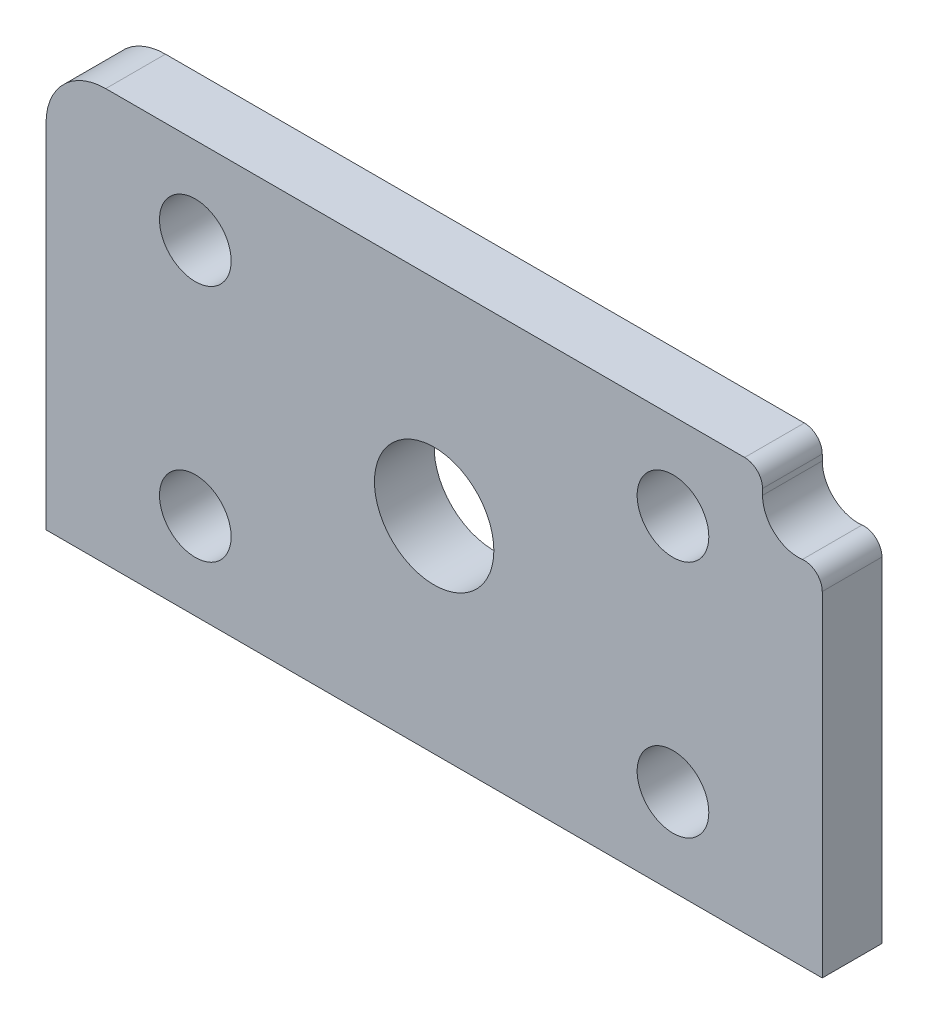
ISO-10303-21;
HEADER;
FILE_DESCRIPTION(('STEP AP214'),'2;1');
FILE_NAME('part.step','',(''),(''),'','','');
FILE_SCHEMA(('AUTOMOTIVE_DESIGN { 1 0 10303 214 1 1 1 1 }'));
ENDSEC;
DATA;
#1=APPLICATION_CONTEXT('core data for automotive mechanical design processes');
#2=APPLICATION_PROTOCOL_DEFINITION('international standard','automotive_design',2000,#1);
#3=PRODUCT_CONTEXT('',#1,'mechanical');
#4=PRODUCT('Part','Part','',(#3));
#5=PRODUCT_RELATED_PRODUCT_CATEGORY('part','',(#4));
#6=PRODUCT_DEFINITION_FORMATION('','',#4);
#7=PRODUCT_DEFINITION_CONTEXT('part definition',#1,'design');
#8=PRODUCT_DEFINITION('design','',#6,#7);
#9=PRODUCT_DEFINITION_SHAPE('','',#8);
#10=(LENGTH_UNIT() NAMED_UNIT(*) SI_UNIT(.MILLI.,.METRE.));
#11=(NAMED_UNIT(*) PLANE_ANGLE_UNIT() SI_UNIT($,.RADIAN.));
#12=(NAMED_UNIT(*) SI_UNIT($,.STERADIAN.) SOLID_ANGLE_UNIT());
#13=UNCERTAINTY_MEASURE_WITH_UNIT(LENGTH_MEASURE(1.E-05),#10,'distance_accuracy_value','');
#14=(GEOMETRIC_REPRESENTATION_CONTEXT(3) GLOBAL_UNCERTAINTY_ASSIGNED_CONTEXT((#13)) GLOBAL_UNIT_ASSIGNED_CONTEXT((#10,
#11,#12)) REPRESENTATION_CONTEXT('',''));
#15=CARTESIAN_POINT('',(0.,0.,0.));
#16=DIRECTION('',(0.,0.,1.));
#17=DIRECTION('',(1.,0.,0.));
#18=AXIS2_PLACEMENT_3D('',#15,#16,#17);
#19=CARTESIAN_POINT('',(65.,34.5,-10.));
#20=DIRECTION('',(1.,0.,0.));
#21=DIRECTION('',(0.,0.,-1.));
#22=AXIS2_PLACEMENT_3D('',#19,#20,#21);
#23=PLANE('',#22);
#24=DIRECTION('',(0.,1.,0.));
#25=VECTOR('',#24,1.);
#26=CARTESIAN_POINT('',(65.,34.5,-10.));
#27=LINE('',#26,#25);
#28=CARTESIAN_POINT('',(65.,-34.5,-10.));
#29=VERTEX_POINT('',#28);
#30=CARTESIAN_POINT('',(65.,21.5557280900008,-10.));
#31=VERTEX_POINT('',#30);
#32=EDGE_CURVE('E209',#29,#31,#27,.T.);
#33=ORIENTED_EDGE('',*,*,#32,.T.);
#34=DIRECTION('',(0.,0.,-1.));
#35=VECTOR('',#34,1.);
#36=CARTESIAN_POINT('',(65.,21.5557280900008,0.));
#37=LINE('',#36,#35);
#38=CARTESIAN_POINT('',(65.,21.5557280900008,0.));
#39=VERTEX_POINT('',#38);
#40=EDGE_CURVE('E11',#31,#39,#37,.F.);
#41=ORIENTED_EDGE('',*,*,#40,.T.);
#42=DIRECTION('',(0.,1.,0.));
#43=VECTOR('',#42,1.);
#44=CARTESIAN_POINT('',(65.,34.5,0.));
#45=LINE('',#44,#43);
#46=CARTESIAN_POINT('',(65.,-34.5,0.));
#47=VERTEX_POINT('',#46);
#48=EDGE_CURVE('E205',#47,#39,#45,.T.);
#49=ORIENTED_EDGE('',*,*,#48,.F.);
#50=DIRECTION('',(0.,0.,1.));
#51=VECTOR('',#50,1.);
#52=CARTESIAN_POINT('',(65.,-34.5,-10.));
#53=LINE('',#52,#51);
#54=EDGE_CURVE('E234',#29,#47,#53,.T.);
#55=ORIENTED_EDGE('',*,*,#54,.F.);
#56=EDGE_LOOP('',(#33,#41,#49,#55));
#57=FACE_BOUND('',#56,.T.);
#58=ADVANCED_FACE('F49',(#57),#23,.T.);
#59=CARTESIAN_POINT('',(-65.,-34.5,-10.));
#60=DIRECTION('',(0.,-1.,0.));
#61=DIRECTION('',(0.,0.,-1.));
#62=AXIS2_PLACEMENT_3D('',#59,#60,#61);
#63=PLANE('',#62);
#64=DIRECTION('',(1.,0.,0.));
#65=VECTOR('',#64,1.);
#66=CARTESIAN_POINT('',(-65.,-34.5,0.));
#67=LINE('',#66,#65);
#68=CARTESIAN_POINT('',(-65.,-34.5,0.));
#69=VERTEX_POINT('',#68);
#70=EDGE_CURVE('E213',#69,#47,#67,.T.);
#71=ORIENTED_EDGE('',*,*,#70,.F.);
#72=DIRECTION('',(0.,0.,1.));
#73=VECTOR('',#72,1.);
#74=CARTESIAN_POINT('',(-65.,-34.5,-10.));
#75=LINE('',#74,#73);
#76=CARTESIAN_POINT('',(-65.,-34.5,-10.));
#77=VERTEX_POINT('',#76);
#78=EDGE_CURVE('E223',#77,#69,#75,.T.);
#79=ORIENTED_EDGE('',*,*,#78,.F.);
#80=DIRECTION('',(1.,0.,0.));
#81=VECTOR('',#80,1.);
#82=CARTESIAN_POINT('',(-65.,-34.5,-10.));
#83=LINE('',#82,#81);
#84=EDGE_CURVE('E219',#77,#29,#83,.T.);
#85=ORIENTED_EDGE('',*,*,#84,.T.);
#86=ORIENTED_EDGE('',*,*,#54,.T.);
#87=EDGE_LOOP('',(#71,#79,#85,#86));
#88=FACE_BOUND('',#87,.T.);
#89=ADVANCED_FACE('F288',(#88),#63,.T.);
#90=CARTESIAN_POINT('',(-65.,34.5,-10.));
#91=DIRECTION('',(-1.,0.,0.));
#92=DIRECTION('',(0.,0.,1.));
#93=AXIS2_PLACEMENT_3D('',#90,#91,#92);
#94=PLANE('',#93);
#95=DIRECTION('',(0.,-1.,0.));
#96=VECTOR('',#95,1.);
#97=CARTESIAN_POINT('',(-65.,34.5,0.));
#98=LINE('',#97,#96);
#99=CARTESIAN_POINT('',(-65.,24.5,0.));
#100=VERTEX_POINT('',#99);
#101=EDGE_CURVE('E229',#100,#69,#98,.T.);
#102=ORIENTED_EDGE('',*,*,#101,.F.);
#103=DIRECTION('',(0.,0.,1.));
#104=VECTOR('',#103,1.);
#105=CARTESIAN_POINT('',(-65.,24.5,-10.));
#106=LINE('',#105,#104);
#107=CARTESIAN_POINT('',(-65.,24.5,-10.));
#108=VERTEX_POINT('',#107);
#109=EDGE_CURVE('E250',#100,#108,#106,.F.);
#110=ORIENTED_EDGE('',*,*,#109,.T.);
#111=DIRECTION('',(0.,-1.,0.));
#112=VECTOR('',#111,1.);
#113=CARTESIAN_POINT('',(-65.,34.5,-10.));
#114=LINE('',#113,#112);
#115=EDGE_CURVE('E216',#108,#77,#114,.T.);
#116=ORIENTED_EDGE('',*,*,#115,.T.);
#117=ORIENTED_EDGE('',*,*,#78,.T.);
#118=EDGE_LOOP('',(#102,#110,#116,#117));
#119=FACE_BOUND('',#118,.T.);
#120=ADVANCED_FACE('F293',(#119),#94,.T.);
#121=CARTESIAN_POINT('',(-65.,34.5,-10.));
#122=DIRECTION('',(0.,1.,0.));
#123=DIRECTION('',(0.,0.,1.));
#124=AXIS2_PLACEMENT_3D('',#121,#122,#123);
#125=PLANE('',#124);
#126=DIRECTION('',(-1.,0.,0.));
#127=VECTOR('',#126,1.);
#128=CARTESIAN_POINT('',(-65.,34.5,0.));
#129=LINE('',#128,#127);
#130=CARTESIAN_POINT('',(52.,34.5,0.));
#131=VERTEX_POINT('',#130);
#132=CARTESIAN_POINT('',(-55.,34.5,0.));
#133=VERTEX_POINT('',#132);
#134=EDGE_CURVE('E226',#131,#133,#129,.T.);
#135=ORIENTED_EDGE('',*,*,#134,.F.);
#136=DIRECTION('',(0.,0.,-1.));
#137=VECTOR('',#136,1.);
#138=CARTESIAN_POINT('',(52.,34.5,-10.));
#139=LINE('',#138,#137);
#140=CARTESIAN_POINT('',(52.,34.5,-10.));
#141=VERTEX_POINT('',#140);
#142=EDGE_CURVE('E252',#131,#141,#139,.T.);
#143=ORIENTED_EDGE('',*,*,#142,.T.);
#144=DIRECTION('',(-1.,0.,0.));
#145=VECTOR('',#144,1.);
#146=CARTESIAN_POINT('',(-65.,34.5,-10.));
#147=LINE('',#146,#145);
#148=CARTESIAN_POINT('',(-55.,34.5,-10.));
#149=VERTEX_POINT('',#148);
#150=EDGE_CURVE('E212',#141,#149,#147,.T.);
#151=ORIENTED_EDGE('',*,*,#150,.T.);
#152=DIRECTION('',(0.,0.,1.));
#153=VECTOR('',#152,1.);
#154=CARTESIAN_POINT('',(-55.,34.5,-10.));
#155=LINE('',#154,#153);
#156=EDGE_CURVE('E242',#149,#133,#155,.T.);
#157=ORIENTED_EDGE('',*,*,#156,.T.);
#158=EDGE_LOOP('',(#135,#143,#151,#157));
#159=FACE_BOUND('',#158,.T.);
#160=ADVANCED_FACE('F276',(#159),#125,.T.);
#161=CARTESIAN_POINT('',(0.,0.,-10.));
#162=DIRECTION('',(0.,0.,1.));
#163=DIRECTION('',(1.,0.,0.));
#164=AXIS2_PLACEMENT_3D('',#161,#162,#163);
#165=PLANE('',#164);
#166=CARTESIAN_POINT('',(40.,20.,-10.));
#167=DIRECTION('',(0.,0.,1.));
#168=DIRECTION('',(1.,0.,0.));
#169=AXIS2_PLACEMENT_3D('',#166,#167,#168);
#170=CIRCLE('',#169,6.);
#171=CARTESIAN_POINT('',(46.,20.,-10.));
#172=VERTEX_POINT('',#171);
#173=EDGE_CURVE('E156',#172,#172,#170,.T.);
#174=ORIENTED_EDGE('',*,*,#173,.T.);
#175=EDGE_LOOP('',(#174));
#176=FACE_BOUND('',#175,.T.);
#177=CARTESIAN_POINT('',(40.,-20.,-10.));
#178=DIRECTION('',(0.,0.,1.));
#179=DIRECTION('',(1.,0.,0.));
#180=AXIS2_PLACEMENT_3D('',#177,#178,#179);
#181=CIRCLE('',#180,6.);
#182=CARTESIAN_POINT('',(46.,-20.,-10.));
#183=VERTEX_POINT('',#182);
#184=EDGE_CURVE('E191',#183,#183,#181,.T.);
#185=ORIENTED_EDGE('',*,*,#184,.T.);
#186=EDGE_LOOP('',(#185));
#187=FACE_BOUND('',#186,.T.);
#188=CARTESIAN_POINT('',(-40.,-20.,-10.));
#189=DIRECTION('',(0.,0.,1.));
#190=DIRECTION('',(1.,0.,0.));
#191=AXIS2_PLACEMENT_3D('',#188,#189,#190);
#192=CIRCLE('',#191,6.);
#193=CARTESIAN_POINT('',(-34.,-20.,-10.));
#194=VERTEX_POINT('',#193);
#195=EDGE_CURVE('E183',#194,#194,#192,.T.);
#196=ORIENTED_EDGE('',*,*,#195,.T.);
#197=EDGE_LOOP('',(#196));
#198=FACE_BOUND('',#197,.T.);
#199=CARTESIAN_POINT('',(-40.,20.,-10.));
#200=DIRECTION('',(0.,0.,1.));
#201=DIRECTION('',(1.,0.,0.));
#202=AXIS2_PLACEMENT_3D('',#199,#200,#201);
#203=CIRCLE('',#202,6.);
#204=CARTESIAN_POINT('',(-34.,20.,-10.));
#205=VERTEX_POINT('',#204);
#206=EDGE_CURVE('E175',#205,#205,#203,.T.);
#207=ORIENTED_EDGE('',*,*,#206,.T.);
#208=EDGE_LOOP('',(#207));
#209=FACE_BOUND('',#208,.T.);
#210=CARTESIAN_POINT('',(0.,0.,-10.));
#211=DIRECTION('',(0.,0.,1.));
#212=DIRECTION('',(1.,0.,0.));
#213=AXIS2_PLACEMENT_3D('',#210,#211,#212);
#214=CIRCLE('',#213,10.);
#215=CARTESIAN_POINT('',(10.,0.,-10.));
#216=VERTEX_POINT('',#215);
#217=EDGE_CURVE('E201',#216,#216,#214,.T.);
#218=ORIENTED_EDGE('',*,*,#217,.T.);
#219=EDGE_LOOP('',(#218));
#220=FACE_BOUND('',#219,.T.);
#221=ORIENTED_EDGE('',*,*,#150,.F.);
#222=CARTESIAN_POINT('',(52.,31.5,-10.));
#223=DIRECTION('',(0.,0.,1.));
#224=DIRECTION('',(1.,0.,0.));
#225=AXIS2_PLACEMENT_3D('',#222,#223,#224);
#226=CIRCLE('',#225,3.);
#227=CARTESIAN_POINT('',(55.,31.5,-10.));
#228=VERTEX_POINT('',#227);
#229=EDGE_CURVE('E143',#141,#228,#226,.F.);
#230=ORIENTED_EDGE('',*,*,#229,.T.);
#231=DIRECTION('',(0.,-1.,0.));
#232=VECTOR('',#231,1.);
#233=CARTESIAN_POINT('',(55.,34.5,-10.));
#234=LINE('',#233,#232);
#235=CARTESIAN_POINT('',(55.,30.5,-10.));
#236=VERTEX_POINT('',#235);
#237=EDGE_CURVE('E137',#228,#236,#234,.T.);
#238=ORIENTED_EDGE('',*,*,#237,.T.);
#239=CARTESIAN_POINT('',(61.,30.5,-10.));
#240=DIRECTION('',(0.,0.,1.));
#241=DIRECTION('',(1.,0.,0.));
#242=AXIS2_PLACEMENT_3D('',#239,#240,#241);
#243=CIRCLE('',#242,6.00000000000001);
#244=CARTESIAN_POINT('',(61.6666666666667,24.5371520600006,-10.));
#245=VERTEX_POINT('',#244);
#246=EDGE_CURVE('E142',#236,#245,#243,.T.);
#247=ORIENTED_EDGE('',*,*,#246,.T.);
#248=CARTESIAN_POINT('',(62.,21.5557280900008,-10.));
#249=DIRECTION('',(0.,0.,1.));
#250=DIRECTION('',(1.,0.,0.));
#251=AXIS2_PLACEMENT_3D('',#248,#249,#250);
#252=CIRCLE('',#251,3.);
#253=EDGE_CURVE('E256',#245,#31,#252,.F.);
#254=ORIENTED_EDGE('',*,*,#253,.T.);
#255=ORIENTED_EDGE('',*,*,#32,.F.);
#256=ORIENTED_EDGE('',*,*,#84,.F.);
#257=ORIENTED_EDGE('',*,*,#115,.F.);
#258=CARTESIAN_POINT('',(-55.,24.5,-10.));
#259=DIRECTION('',(0.,0.,1.));
#260=DIRECTION('',(1.,0.,0.));
#261=AXIS2_PLACEMENT_3D('',#258,#259,#260);
#262=CIRCLE('',#261,10.);
#263=EDGE_CURVE('E246',#108,#149,#262,.F.);
#264=ORIENTED_EDGE('',*,*,#263,.T.);
#265=EDGE_LOOP('',(#221,#230,#238,#247,#254,#255,#256,#257,#264));
#266=FACE_BOUND('',#265,.T.);
#267=ADVANCED_FACE('F140',(#176,#187,#198,#209,#220,#266),#165,.F.);
#268=CARTESIAN_POINT('',(0.,0.,0.));
#269=DIRECTION('',(0.,0.,1.));
#270=DIRECTION('',(1.,0.,0.));
#271=AXIS2_PLACEMENT_3D('',#268,#269,#270);
#272=PLANE('',#271);
#273=DIRECTION('',(0.,-1.,0.));
#274=VECTOR('',#273,1.);
#275=CARTESIAN_POINT('',(55.,34.5,0.));
#276=LINE('',#275,#274);
#277=CARTESIAN_POINT('',(55.,31.5,0.));
#278=VERTEX_POINT('',#277);
#279=CARTESIAN_POINT('',(55.,30.5,0.));
#280=VERTEX_POINT('',#279);
#281=EDGE_CURVE('E153',#278,#280,#276,.T.);
#282=ORIENTED_EDGE('',*,*,#281,.F.);
#283=CARTESIAN_POINT('',(52.,31.5,0.));
#284=DIRECTION('',(0.,0.,1.));
#285=DIRECTION('',(1.,0.,0.));
#286=AXIS2_PLACEMENT_3D('',#283,#284,#285);
#287=CIRCLE('',#286,3.);
#288=EDGE_CURVE('E266',#278,#131,#287,.T.);
#289=ORIENTED_EDGE('',*,*,#288,.T.);
#290=ORIENTED_EDGE('',*,*,#134,.T.);
#291=CARTESIAN_POINT('',(-55.,24.5,0.));
#292=DIRECTION('',(0.,0.,1.));
#293=DIRECTION('',(1.,0.,0.));
#294=AXIS2_PLACEMENT_3D('',#291,#292,#293);
#295=CIRCLE('',#294,10.);
#296=EDGE_CURVE('E237',#133,#100,#295,.T.);
#297=ORIENTED_EDGE('',*,*,#296,.T.);
#298=ORIENTED_EDGE('',*,*,#101,.T.);
#299=ORIENTED_EDGE('',*,*,#70,.T.);
#300=ORIENTED_EDGE('',*,*,#48,.T.);
#301=CARTESIAN_POINT('',(62.,21.5557280900008,0.));
#302=DIRECTION('',(0.,0.,1.));
#303=DIRECTION('',(1.,0.,0.));
#304=AXIS2_PLACEMENT_3D('',#301,#302,#303);
#305=CIRCLE('',#304,3.);
#306=CARTESIAN_POINT('',(61.6666666666667,24.5371520600006,0.));
#307=VERTEX_POINT('',#306);
#308=EDGE_CURVE('E75',#39,#307,#305,.T.);
#309=ORIENTED_EDGE('',*,*,#308,.T.);
#310=CARTESIAN_POINT('',(61.,30.5,0.));
#311=DIRECTION('',(0.,0.,1.));
#312=DIRECTION('',(1.,0.,0.));
#313=AXIS2_PLACEMENT_3D('',#310,#311,#312);
#314=CIRCLE('',#313,6.00000000000001);
#315=EDGE_CURVE('E147',#280,#307,#314,.T.);
#316=ORIENTED_EDGE('',*,*,#315,.F.);
#317=EDGE_LOOP('',(#282,#289,#290,#297,#298,#299,#300,#309,#316));
#318=FACE_BOUND('',#317,.T.);
#319=CARTESIAN_POINT('',(40.,20.,0.));
#320=DIRECTION('',(0.,0.,1.));
#321=DIRECTION('',(1.,0.,0.));
#322=AXIS2_PLACEMENT_3D('',#319,#320,#321);
#323=CIRCLE('',#322,6.);
#324=CARTESIAN_POINT('',(46.,20.,0.));
#325=VERTEX_POINT('',#324);
#326=EDGE_CURVE('E194',#325,#325,#323,.T.);
#327=ORIENTED_EDGE('',*,*,#326,.F.);
#328=EDGE_LOOP('',(#327));
#329=FACE_BOUND('',#328,.T.);
#330=CARTESIAN_POINT('',(40.,-20.,0.));
#331=DIRECTION('',(0.,0.,1.));
#332=DIRECTION('',(1.,0.,0.));
#333=AXIS2_PLACEMENT_3D('',#330,#331,#332);
#334=CIRCLE('',#333,6.);
#335=CARTESIAN_POINT('',(46.,-20.,0.));
#336=VERTEX_POINT('',#335);
#337=EDGE_CURVE('E187',#336,#336,#334,.T.);
#338=ORIENTED_EDGE('',*,*,#337,.F.);
#339=EDGE_LOOP('',(#338));
#340=FACE_BOUND('',#339,.T.);
#341=CARTESIAN_POINT('',(-40.,-20.,0.));
#342=DIRECTION('',(0.,0.,1.));
#343=DIRECTION('',(1.,0.,0.));
#344=AXIS2_PLACEMENT_3D('',#341,#342,#343);
#345=CIRCLE('',#344,6.);
#346=CARTESIAN_POINT('',(-34.,-20.,0.));
#347=VERTEX_POINT('',#346);
#348=EDGE_CURVE('E179',#347,#347,#345,.T.);
#349=ORIENTED_EDGE('',*,*,#348,.F.);
#350=EDGE_LOOP('',(#349));
#351=FACE_BOUND('',#350,.T.);
#352=CARTESIAN_POINT('',(-40.,20.,0.));
#353=DIRECTION('',(0.,0.,1.));
#354=DIRECTION('',(1.,0.,0.));
#355=AXIS2_PLACEMENT_3D('',#352,#353,#354);
#356=CIRCLE('',#355,6.);
#357=CARTESIAN_POINT('',(-34.,20.,0.));
#358=VERTEX_POINT('',#357);
#359=EDGE_CURVE('E170',#358,#358,#356,.T.);
#360=ORIENTED_EDGE('',*,*,#359,.F.);
#361=EDGE_LOOP('',(#360));
#362=FACE_BOUND('',#361,.T.);
#363=CARTESIAN_POINT('',(0.,0.,0.));
#364=DIRECTION('',(0.,0.,1.));
#365=DIRECTION('',(1.,0.,0.));
#366=AXIS2_PLACEMENT_3D('',#363,#364,#365);
#367=CIRCLE('',#366,10.);
#368=CARTESIAN_POINT('',(10.,0.,0.));
#369=VERTEX_POINT('',#368);
#370=EDGE_CURVE('E174',#369,#369,#367,.T.);
#371=ORIENTED_EDGE('',*,*,#370,.F.);
#372=EDGE_LOOP('',(#371));
#373=FACE_BOUND('',#372,.T.);
#374=ADVANCED_FACE('F270',(#318,#329,#340,#351,#362,#373),#272,.T.);
#375=CARTESIAN_POINT('',(0.,0.,-10.));
#376=DIRECTION('',(0.,0.,1.));
#377=DIRECTION('',(1.,0.,0.));
#378=AXIS2_PLACEMENT_3D('',#375,#376,#377);
#379=CYLINDRICAL_SURFACE('',#378,10.);
#380=ORIENTED_EDGE('',*,*,#217,.F.);
#381=EDGE_LOOP('',(#380));
#382=FACE_BOUND('',#381,.T.);
#383=ORIENTED_EDGE('',*,*,#370,.T.);
#384=EDGE_LOOP('',(#383));
#385=FACE_BOUND('',#384,.T.);
#386=ADVANCED_FACE('F326',(#382,#385),#379,.F.);
#387=CARTESIAN_POINT('',(-40.,20.,-10.));
#388=DIRECTION('',(0.,0.,1.));
#389=DIRECTION('',(1.,0.,0.));
#390=AXIS2_PLACEMENT_3D('',#387,#388,#389);
#391=CYLINDRICAL_SURFACE('',#390,6.);
#392=ORIENTED_EDGE('',*,*,#206,.F.);
#393=EDGE_LOOP('',(#392));
#394=FACE_BOUND('',#393,.T.);
#395=ORIENTED_EDGE('',*,*,#359,.T.);
#396=EDGE_LOOP('',(#395));
#397=FACE_BOUND('',#396,.T.);
#398=ADVANCED_FACE('F331',(#394,#397),#391,.F.);
#399=CARTESIAN_POINT('',(-40.,-20.,-10.));
#400=DIRECTION('',(0.,0.,1.));
#401=DIRECTION('',(1.,0.,0.));
#402=AXIS2_PLACEMENT_3D('',#399,#400,#401);
#403=CYLINDRICAL_SURFACE('',#402,6.);
#404=ORIENTED_EDGE('',*,*,#195,.F.);
#405=EDGE_LOOP('',(#404));
#406=FACE_BOUND('',#405,.T.);
#407=ORIENTED_EDGE('',*,*,#348,.T.);
#408=EDGE_LOOP('',(#407));
#409=FACE_BOUND('',#408,.T.);
#410=ADVANCED_FACE('F336',(#406,#409),#403,.F.);
#411=CARTESIAN_POINT('',(40.,-20.,-10.));
#412=DIRECTION('',(0.,0.,1.));
#413=DIRECTION('',(1.,0.,0.));
#414=AXIS2_PLACEMENT_3D('',#411,#412,#413);
#415=CYLINDRICAL_SURFACE('',#414,6.);
#416=ORIENTED_EDGE('',*,*,#184,.F.);
#417=EDGE_LOOP('',(#416));
#418=FACE_BOUND('',#417,.T.);
#419=ORIENTED_EDGE('',*,*,#337,.T.);
#420=EDGE_LOOP('',(#419));
#421=FACE_BOUND('',#420,.T.);
#422=ADVANCED_FACE('F307',(#418,#421),#415,.F.);
#423=CARTESIAN_POINT('',(40.,20.,-10.));
#424=DIRECTION('',(0.,0.,1.));
#425=DIRECTION('',(1.,0.,0.));
#426=AXIS2_PLACEMENT_3D('',#423,#424,#425);
#427=CYLINDRICAL_SURFACE('',#426,6.);
#428=ORIENTED_EDGE('',*,*,#173,.F.);
#429=EDGE_LOOP('',(#428));
#430=FACE_BOUND('',#429,.T.);
#431=ORIENTED_EDGE('',*,*,#326,.T.);
#432=EDGE_LOOP('',(#431));
#433=FACE_BOUND('',#432,.T.);
#434=ADVANCED_FACE('F300',(#430,#433),#427,.F.);
#435=CARTESIAN_POINT('',(-55.,24.5,-10.));
#436=DIRECTION('',(0.,0.,1.));
#437=DIRECTION('',(1.,0.,0.));
#438=AXIS2_PLACEMENT_3D('',#435,#436,#437);
#439=CYLINDRICAL_SURFACE('',#438,10.);
#440=ORIENTED_EDGE('',*,*,#263,.F.);
#441=ORIENTED_EDGE('',*,*,#109,.F.);
#442=ORIENTED_EDGE('',*,*,#296,.F.);
#443=ORIENTED_EDGE('',*,*,#156,.F.);
#444=EDGE_LOOP('',(#440,#441,#442,#443));
#445=FACE_BOUND('',#444,.T.);
#446=ADVANCED_FACE('F298',(#445),#439,.T.);
#447=CARTESIAN_POINT('',(61.,30.5,-10.));
#448=DIRECTION('',(0.,0.,1.));
#449=DIRECTION('',(1.,0.,0.));
#450=AXIS2_PLACEMENT_3D('',#447,#448,#449);
#451=CYLINDRICAL_SURFACE('',#450,6.00000000000001);
#452=ORIENTED_EDGE('',*,*,#315,.T.);
#453=DIRECTION('',(0.,0.,1.));
#454=VECTOR('',#453,1.);
#455=CARTESIAN_POINT('',(61.6666666666667,24.5371520600006,-10.));
#456=LINE('',#455,#454);
#457=EDGE_CURVE('E58',#307,#245,#456,.F.);
#458=ORIENTED_EDGE('',*,*,#457,.T.);
#459=ORIENTED_EDGE('',*,*,#246,.F.);
#460=DIRECTION('',(0.,0.,1.));
#461=VECTOR('',#460,1.);
#462=CARTESIAN_POINT('',(55.,30.5,-10.));
#463=LINE('',#462,#461);
#464=EDGE_CURVE('E150',#236,#280,#463,.T.);
#465=ORIENTED_EDGE('',*,*,#464,.T.);
#466=EDGE_LOOP('',(#452,#458,#459,#465));
#467=FACE_BOUND('',#466,.T.);
#468=ADVANCED_FACE('F159',(#467),#451,.F.);
#469=CARTESIAN_POINT('',(55.,34.5,-10.));
#470=DIRECTION('',(-1.,0.,0.));
#471=DIRECTION('',(0.,0.,1.));
#472=AXIS2_PLACEMENT_3D('',#469,#470,#471);
#473=PLANE('',#472);
#474=ORIENTED_EDGE('',*,*,#237,.F.);
#475=DIRECTION('',(0.,0.,-1.));
#476=VECTOR('',#475,1.);
#477=CARTESIAN_POINT('',(55.,31.5,0.));
#478=LINE('',#477,#476);
#479=EDGE_CURVE('E261',#228,#278,#478,.F.);
#480=ORIENTED_EDGE('',*,*,#479,.T.);
#481=ORIENTED_EDGE('',*,*,#281,.T.);
#482=ORIENTED_EDGE('',*,*,#464,.F.);
#483=EDGE_LOOP('',(#474,#480,#481,#482));
#484=FACE_BOUND('',#483,.T.);
#485=ADVANCED_FACE('F151',(#484),#473,.F.);
#486=CARTESIAN_POINT('',(52.,31.5,-10.));
#487=DIRECTION('',(0.,0.,1.));
#488=DIRECTION('',(1.,0.,0.));
#489=AXIS2_PLACEMENT_3D('',#486,#487,#488);
#490=CYLINDRICAL_SURFACE('',#489,3.);
#491=ORIENTED_EDGE('',*,*,#288,.F.);
#492=ORIENTED_EDGE('',*,*,#479,.F.);
#493=ORIENTED_EDGE('',*,*,#229,.F.);
#494=ORIENTED_EDGE('',*,*,#142,.F.);
#495=EDGE_LOOP('',(#491,#492,#493,#494));
#496=FACE_BOUND('',#495,.T.);
#497=ADVANCED_FACE('F278',(#496),#490,.T.);
#498=CARTESIAN_POINT('',(62.,21.5557280900008,-10.));
#499=DIRECTION('',(0.,0.,1.));
#500=DIRECTION('',(1.,0.,0.));
#501=AXIS2_PLACEMENT_3D('',#498,#499,#500);
#502=CYLINDRICAL_SURFACE('',#501,3.);
#503=ORIENTED_EDGE('',*,*,#308,.F.);
#504=ORIENTED_EDGE('',*,*,#40,.F.);
#505=ORIENTED_EDGE('',*,*,#253,.F.);
#506=ORIENTED_EDGE('',*,*,#457,.F.);
#507=EDGE_LOOP('',(#503,#504,#505,#506));
#508=FACE_BOUND('',#507,.T.);
#509=ADVANCED_FACE('F51',(#508),#502,.T.);
#510=CLOSED_SHELL('',(#58,#89,#120,#160,#267,#374,#386,#398,#410,#422,#434,#446,#468,#485,#497,#509));
#511=MANIFOLD_SOLID_BREP('B2',#510);
#512=ADVANCED_BREP_SHAPE_REPRESENTATION('',(#18,#511),#14);
#513=SHAPE_DEFINITION_REPRESENTATION(#9,#512);
ENDSEC;
END-ISO-10303-21;
